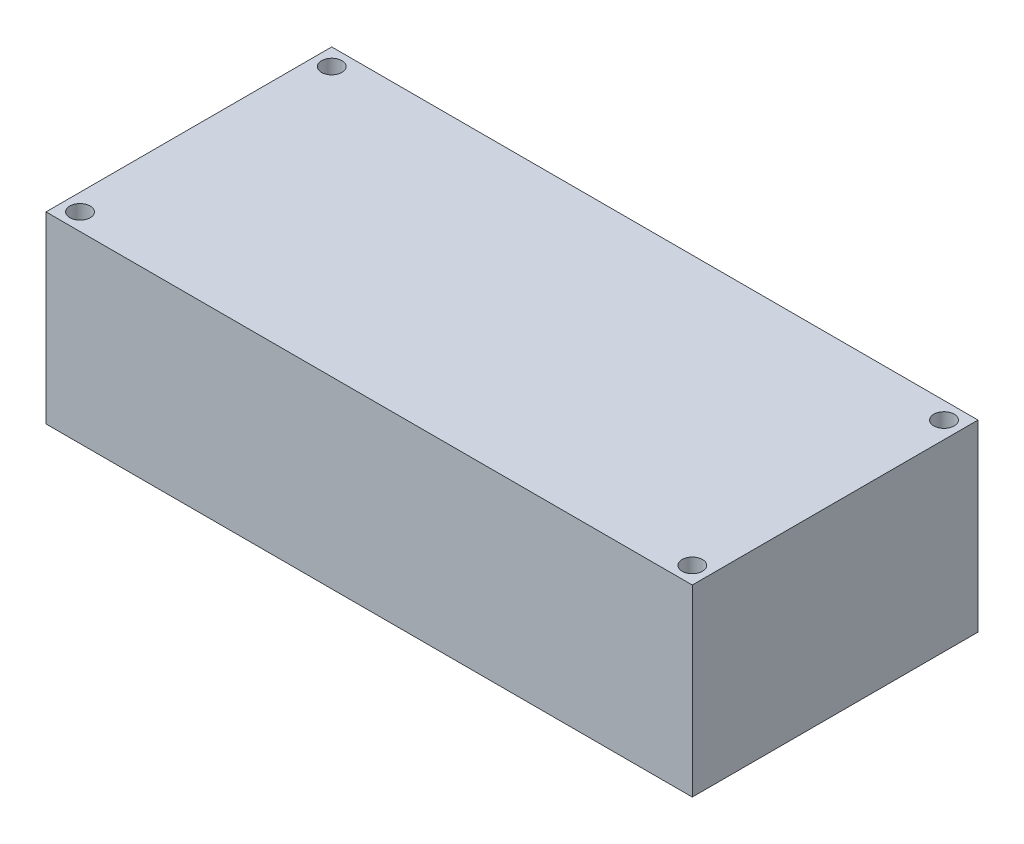
ISO-10303-21;
HEADER;
FILE_DESCRIPTION(('STEP AP214'),'2;1');
FILE_NAME('part.step','',(''),(''),'','','');
FILE_SCHEMA(('AUTOMOTIVE_DESIGN { 1 0 10303 214 1 1 1 1 }'));
ENDSEC;
DATA;
#1=APPLICATION_CONTEXT('core data for automotive mechanical design processes');
#2=APPLICATION_PROTOCOL_DEFINITION('international standard','automotive_design',2000,#1);
#3=PRODUCT_CONTEXT('',#1,'mechanical');
#4=PRODUCT('Part','Part','',(#3));
#5=PRODUCT_RELATED_PRODUCT_CATEGORY('part','',(#4));
#6=PRODUCT_DEFINITION_FORMATION('','',#4);
#7=PRODUCT_DEFINITION_CONTEXT('part definition',#1,'design');
#8=PRODUCT_DEFINITION('design','',#6,#7);
#9=PRODUCT_DEFINITION_SHAPE('','',#8);
#10=(LENGTH_UNIT() NAMED_UNIT(*) SI_UNIT(.MILLI.,.METRE.));
#11=(NAMED_UNIT(*) PLANE_ANGLE_UNIT() SI_UNIT($,.RADIAN.));
#12=(NAMED_UNIT(*) SI_UNIT($,.STERADIAN.) SOLID_ANGLE_UNIT());
#13=UNCERTAINTY_MEASURE_WITH_UNIT(LENGTH_MEASURE(1.E-05),#10,'distance_accuracy_value','');
#14=(GEOMETRIC_REPRESENTATION_CONTEXT(3) GLOBAL_UNCERTAINTY_ASSIGNED_CONTEXT((#13)) GLOBAL_UNIT_ASSIGNED_CONTEXT((#10,
#11,#12)) REPRESENTATION_CONTEXT('',''));
#15=CARTESIAN_POINT('',(0.,0.,0.));
#16=DIRECTION('',(0.,0.,1.));
#17=DIRECTION('',(1.,0.,0.));
#18=AXIS2_PLACEMENT_3D('',#15,#16,#17);
#19=CARTESIAN_POINT('',(47.5,27.,-21.));
#20=DIRECTION('',(0.,-1.,0.));
#21=DIRECTION('',(0.,0.,-1.));
#22=AXIS2_PLACEMENT_3D('',#19,#20,#21);
#23=PLANE('',#22);
#24=CARTESIAN_POINT('',(45.,27.,-18.5));
#25=DIRECTION('',(0.,1.,0.));
#26=DIRECTION('',(0.,0.,1.));
#27=AXIS2_PLACEMENT_3D('',#24,#25,#26);
#28=CIRCLE('',#27,1.5);
#29=CARTESIAN_POINT('',(45.,27.,-17.));
#30=VERTEX_POINT('',#29);
#31=EDGE_CURVE('E120',#30,#30,#28,.T.);
#32=ORIENTED_EDGE('',*,*,#31,.F.);
#33=EDGE_LOOP('',(#32));
#34=FACE_BOUND('',#33,.T.);
#35=CARTESIAN_POINT('',(-45.,27.,-18.5));
#36=DIRECTION('',(0.,1.,0.));
#37=DIRECTION('',(0.,0.,1.));
#38=AXIS2_PLACEMENT_3D('',#35,#36,#37);
#39=CIRCLE('',#38,1.5);
#40=CARTESIAN_POINT('',(-45.,27.,-17.));
#41=VERTEX_POINT('',#40);
#42=EDGE_CURVE('E99',#41,#41,#39,.T.);
#43=ORIENTED_EDGE('',*,*,#42,.F.);
#44=EDGE_LOOP('',(#43));
#45=FACE_BOUND('',#44,.T.);
#46=DIRECTION('',(0.,0.,-1.));
#47=VECTOR('',#46,1.);
#48=CARTESIAN_POINT('',(47.5,27.,21.));
#49=LINE('',#48,#47);
#50=CARTESIAN_POINT('',(47.5,27.,21.));
#51=VERTEX_POINT('',#50);
#52=CARTESIAN_POINT('',(47.5,27.,-21.));
#53=VERTEX_POINT('',#52);
#54=EDGE_CURVE('E84',#51,#53,#49,.T.);
#55=ORIENTED_EDGE('',*,*,#54,.T.);
#56=DIRECTION('',(-1.,0.,0.));
#57=VECTOR('',#56,1.);
#58=CARTESIAN_POINT('',(-47.5,27.,-21.));
#59=LINE('',#58,#57);
#60=CARTESIAN_POINT('',(-47.5,27.,-21.));
#61=VERTEX_POINT('',#60);
#62=EDGE_CURVE('E79',#53,#61,#59,.T.);
#63=ORIENTED_EDGE('',*,*,#62,.T.);
#64=DIRECTION('',(0.,0.,1.));
#65=VECTOR('',#64,1.);
#66=CARTESIAN_POINT('',(-47.5,27.,21.));
#67=LINE('',#66,#65);
#68=CARTESIAN_POINT('',(-47.5,27.,21.));
#69=VERTEX_POINT('',#68);
#70=EDGE_CURVE('E82',#61,#69,#67,.T.);
#71=ORIENTED_EDGE('',*,*,#70,.T.);
#72=DIRECTION('',(1.,0.,0.));
#73=VECTOR('',#72,1.);
#74=CARTESIAN_POINT('',(-47.5,27.,21.));
#75=LINE('',#74,#73);
#76=EDGE_CURVE('E49',#69,#51,#75,.T.);
#77=ORIENTED_EDGE('',*,*,#76,.T.);
#78=EDGE_LOOP('',(#55,#63,#71,#77));
#79=FACE_BOUND('',#78,.T.);
#80=CARTESIAN_POINT('',(-45.,27.,18.5));
#81=DIRECTION('',(0.,1.,0.));
#82=DIRECTION('',(0.,0.,1.));
#83=AXIS2_PLACEMENT_3D('',#80,#81,#82);
#84=CIRCLE('',#83,1.5);
#85=CARTESIAN_POINT('',(-45.,27.,20.));
#86=VERTEX_POINT('',#85);
#87=EDGE_CURVE('E114',#86,#86,#84,.T.);
#88=ORIENTED_EDGE('',*,*,#87,.F.);
#89=EDGE_LOOP('',(#88));
#90=FACE_BOUND('',#89,.T.);
#91=CARTESIAN_POINT('',(45.,27.,18.5));
#92=DIRECTION('',(0.,1.,0.));
#93=DIRECTION('',(0.,0.,1.));
#94=AXIS2_PLACEMENT_3D('',#91,#92,#93);
#95=CIRCLE('',#94,1.5);
#96=CARTESIAN_POINT('',(45.,27.,20.));
#97=VERTEX_POINT('',#96);
#98=EDGE_CURVE('E126',#97,#97,#95,.T.);
#99=ORIENTED_EDGE('',*,*,#98,.F.);
#100=EDGE_LOOP('',(#99));
#101=FACE_BOUND('',#100,.T.);
#102=ADVANCED_FACE('F32',(#34,#45,#79,#90,#101),#23,.F.);
#103=CARTESIAN_POINT('',(47.5,0.,-21.));
#104=DIRECTION('',(0.,-1.,0.));
#105=DIRECTION('',(0.,0.,-1.));
#106=AXIS2_PLACEMENT_3D('',#103,#104,#105);
#107=PLANE('',#106);
#108=CARTESIAN_POINT('',(45.,0.,-18.5));
#109=DIRECTION('',(0.,1.,0.));
#110=DIRECTION('',(0.,0.,1.));
#111=AXIS2_PLACEMENT_3D('',#108,#109,#110);
#112=CIRCLE('',#111,1.5);
#113=CARTESIAN_POINT('',(45.,0.,-17.));
#114=VERTEX_POINT('',#113);
#115=EDGE_CURVE('E123',#114,#114,#112,.T.);
#116=ORIENTED_EDGE('',*,*,#115,.T.);
#117=EDGE_LOOP('',(#116));
#118=FACE_BOUND('',#117,.T.);
#119=CARTESIAN_POINT('',(-45.,0.,-18.5));
#120=DIRECTION('',(0.,1.,0.));
#121=DIRECTION('',(0.,0.,1.));
#122=AXIS2_PLACEMENT_3D('',#119,#120,#121);
#123=CIRCLE('',#122,1.5);
#124=CARTESIAN_POINT('',(-45.,0.,-17.));
#125=VERTEX_POINT('',#124);
#126=EDGE_CURVE('E111',#125,#125,#123,.T.);
#127=ORIENTED_EDGE('',*,*,#126,.T.);
#128=EDGE_LOOP('',(#127));
#129=FACE_BOUND('',#128,.T.);
#130=DIRECTION('',(0.,0.,-1.));
#131=VECTOR('',#130,1.);
#132=CARTESIAN_POINT('',(47.5,0.,21.));
#133=LINE('',#132,#131);
#134=CARTESIAN_POINT('',(47.5,0.,21.));
#135=VERTEX_POINT('',#134);
#136=CARTESIAN_POINT('',(47.5,0.,-21.));
#137=VERTEX_POINT('',#136);
#138=EDGE_CURVE('E96',#135,#137,#133,.T.);
#139=ORIENTED_EDGE('',*,*,#138,.F.);
#140=DIRECTION('',(1.,0.,0.));
#141=VECTOR('',#140,1.);
#142=CARTESIAN_POINT('',(-47.5,0.,21.));
#143=LINE('',#142,#141);
#144=CARTESIAN_POINT('',(-47.5,0.,21.));
#145=VERTEX_POINT('',#144);
#146=EDGE_CURVE('E72',#145,#135,#143,.T.);
#147=ORIENTED_EDGE('',*,*,#146,.F.);
#148=DIRECTION('',(0.,0.,1.));
#149=VECTOR('',#148,1.);
#150=CARTESIAN_POINT('',(-47.5,0.,21.));
#151=LINE('',#150,#149);
#152=CARTESIAN_POINT('',(-47.5,0.,-21.));
#153=VERTEX_POINT('',#152);
#154=EDGE_CURVE('E66',#153,#145,#151,.T.);
#155=ORIENTED_EDGE('',*,*,#154,.F.);
#156=DIRECTION('',(-1.,0.,0.));
#157=VECTOR('',#156,1.);
#158=CARTESIAN_POINT('',(-47.5,0.,-21.));
#159=LINE('',#158,#157);
#160=EDGE_CURVE('E88',#137,#153,#159,.T.);
#161=ORIENTED_EDGE('',*,*,#160,.F.);
#162=EDGE_LOOP('',(#139,#147,#155,#161));
#163=FACE_BOUND('',#162,.T.);
#164=CARTESIAN_POINT('',(-45.,0.,18.5));
#165=DIRECTION('',(0.,1.,0.));
#166=DIRECTION('',(0.,0.,1.));
#167=AXIS2_PLACEMENT_3D('',#164,#165,#166);
#168=CIRCLE('',#167,1.5);
#169=CARTESIAN_POINT('',(-45.,0.,20.));
#170=VERTEX_POINT('',#169);
#171=EDGE_CURVE('E117',#170,#170,#168,.T.);
#172=ORIENTED_EDGE('',*,*,#171,.T.);
#173=EDGE_LOOP('',(#172));
#174=FACE_BOUND('',#173,.T.);
#175=CARTESIAN_POINT('',(45.,0.,18.5));
#176=DIRECTION('',(0.,1.,0.));
#177=DIRECTION('',(0.,0.,1.));
#178=AXIS2_PLACEMENT_3D('',#175,#176,#177);
#179=CIRCLE('',#178,1.5);
#180=CARTESIAN_POINT('',(45.,0.,20.));
#181=VERTEX_POINT('',#180);
#182=EDGE_CURVE('E129',#181,#181,#179,.T.);
#183=ORIENTED_EDGE('',*,*,#182,.T.);
#184=EDGE_LOOP('',(#183));
#185=FACE_BOUND('',#184,.T.);
#186=ADVANCED_FACE('F107',(#118,#129,#163,#174,#185),#107,.T.);
#187=CARTESIAN_POINT('',(47.5,27.,21.));
#188=DIRECTION('',(-1.,0.,0.));
#189=DIRECTION('',(0.,0.,1.));
#190=AXIS2_PLACEMENT_3D('',#187,#188,#189);
#191=PLANE('',#190);
#192=ORIENTED_EDGE('',*,*,#138,.T.);
#193=DIRECTION('',(0.,-1.,0.));
#194=VECTOR('',#193,1.);
#195=CARTESIAN_POINT('',(47.5,27.,-21.));
#196=LINE('',#195,#194);
#197=EDGE_CURVE('E11',#53,#137,#196,.T.);
#198=ORIENTED_EDGE('',*,*,#197,.F.);
#199=ORIENTED_EDGE('',*,*,#54,.F.);
#200=DIRECTION('',(0.,-1.,0.));
#201=VECTOR('',#200,1.);
#202=CARTESIAN_POINT('',(47.5,27.,21.));
#203=LINE('',#202,#201);
#204=EDGE_CURVE('E92',#51,#135,#203,.T.);
#205=ORIENTED_EDGE('',*,*,#204,.T.);
#206=EDGE_LOOP('',(#192,#198,#199,#205));
#207=FACE_BOUND('',#206,.T.);
#208=ADVANCED_FACE('F34',(#207),#191,.F.);
#209=CARTESIAN_POINT('',(-47.5,27.,-21.));
#210=DIRECTION('',(0.,0.,1.));
#211=DIRECTION('',(1.,0.,0.));
#212=AXIS2_PLACEMENT_3D('',#209,#210,#211);
#213=PLANE('',#212);
#214=ORIENTED_EDGE('',*,*,#160,.T.);
#215=DIRECTION('',(0.,-1.,0.));
#216=VECTOR('',#215,1.);
#217=CARTESIAN_POINT('',(-47.5,27.,-21.));
#218=LINE('',#217,#216);
#219=EDGE_CURVE('E41',#61,#153,#218,.T.);
#220=ORIENTED_EDGE('',*,*,#219,.F.);
#221=ORIENTED_EDGE('',*,*,#62,.F.);
#222=ORIENTED_EDGE('',*,*,#197,.T.);
#223=EDGE_LOOP('',(#214,#220,#221,#222));
#224=FACE_BOUND('',#223,.T.);
#225=ADVANCED_FACE('F87',(#224),#213,.F.);
#226=CARTESIAN_POINT('',(-47.5,27.,21.));
#227=DIRECTION('',(1.,0.,0.));
#228=DIRECTION('',(0.,0.,-1.));
#229=AXIS2_PLACEMENT_3D('',#226,#227,#228);
#230=PLANE('',#229);
#231=ORIENTED_EDGE('',*,*,#154,.T.);
#232=DIRECTION('',(0.,-1.,0.));
#233=VECTOR('',#232,1.);
#234=CARTESIAN_POINT('',(-47.5,27.,21.));
#235=LINE('',#234,#233);
#236=EDGE_CURVE('E89',#69,#145,#235,.T.);
#237=ORIENTED_EDGE('',*,*,#236,.F.);
#238=ORIENTED_EDGE('',*,*,#70,.F.);
#239=ORIENTED_EDGE('',*,*,#219,.T.);
#240=EDGE_LOOP('',(#231,#237,#238,#239));
#241=FACE_BOUND('',#240,.T.);
#242=ADVANCED_FACE('F90',(#241),#230,.F.);
#243=CARTESIAN_POINT('',(-47.5,27.,21.));
#244=DIRECTION('',(0.,0.,-1.));
#245=DIRECTION('',(-1.,0.,0.));
#246=AXIS2_PLACEMENT_3D('',#243,#244,#245);
#247=PLANE('',#246);
#248=ORIENTED_EDGE('',*,*,#146,.T.);
#249=ORIENTED_EDGE('',*,*,#204,.F.);
#250=ORIENTED_EDGE('',*,*,#76,.F.);
#251=ORIENTED_EDGE('',*,*,#236,.T.);
#252=EDGE_LOOP('',(#248,#249,#250,#251));
#253=FACE_BOUND('',#252,.T.);
#254=ADVANCED_FACE('F104',(#253),#247,.F.);
#255=CARTESIAN_POINT('',(-45.,27.,-18.5));
#256=DIRECTION('',(0.,-1.,0.));
#257=DIRECTION('',(0.,0.,-1.));
#258=AXIS2_PLACEMENT_3D('',#255,#256,#257);
#259=CYLINDRICAL_SURFACE('',#258,1.5);
#260=ORIENTED_EDGE('',*,*,#42,.T.);
#261=EDGE_LOOP('',(#260));
#262=FACE_BOUND('',#261,.T.);
#263=ORIENTED_EDGE('',*,*,#126,.F.);
#264=EDGE_LOOP('',(#263));
#265=FACE_BOUND('',#264,.T.);
#266=ADVANCED_FACE('F149',(#262,#265),#259,.F.);
#267=CARTESIAN_POINT('',(-45.,27.,18.5));
#268=DIRECTION('',(0.,-1.,0.));
#269=DIRECTION('',(0.,0.,-1.));
#270=AXIS2_PLACEMENT_3D('',#267,#268,#269);
#271=CYLINDRICAL_SURFACE('',#270,1.5);
#272=ORIENTED_EDGE('',*,*,#87,.T.);
#273=EDGE_LOOP('',(#272));
#274=FACE_BOUND('',#273,.T.);
#275=ORIENTED_EDGE('',*,*,#171,.F.);
#276=EDGE_LOOP('',(#275));
#277=FACE_BOUND('',#276,.T.);
#278=ADVANCED_FACE('F195',(#274,#277),#271,.F.);
#279=CARTESIAN_POINT('',(45.,27.,-18.5));
#280=DIRECTION('',(0.,-1.,0.));
#281=DIRECTION('',(0.,0.,-1.));
#282=AXIS2_PLACEMENT_3D('',#279,#280,#281);
#283=CYLINDRICAL_SURFACE('',#282,1.5);
#284=ORIENTED_EDGE('',*,*,#31,.T.);
#285=EDGE_LOOP('',(#284));
#286=FACE_BOUND('',#285,.T.);
#287=ORIENTED_EDGE('',*,*,#115,.F.);
#288=EDGE_LOOP('',(#287));
#289=FACE_BOUND('',#288,.T.);
#290=ADVANCED_FACE('F203',(#286,#289),#283,.F.);
#291=CARTESIAN_POINT('',(45.,27.,18.5));
#292=DIRECTION('',(0.,-1.,0.));
#293=DIRECTION('',(0.,0.,-1.));
#294=AXIS2_PLACEMENT_3D('',#291,#292,#293);
#295=CYLINDRICAL_SURFACE('',#294,1.5);
#296=ORIENTED_EDGE('',*,*,#98,.T.);
#297=EDGE_LOOP('',(#296));
#298=FACE_BOUND('',#297,.T.);
#299=ORIENTED_EDGE('',*,*,#182,.F.);
#300=EDGE_LOOP('',(#299));
#301=FACE_BOUND('',#300,.T.);
#302=ADVANCED_FACE('F135',(#298,#301),#295,.F.);
#303=CLOSED_SHELL('',(#102,#186,#208,#225,#242,#254,#266,#278,#290,#302));
#304=MANIFOLD_SOLID_BREP('B2',#303);
#305=ADVANCED_BREP_SHAPE_REPRESENTATION('',(#18,#304),#14);
#306=SHAPE_DEFINITION_REPRESENTATION(#9,#305);
ENDSEC;
END-ISO-10303-21;
